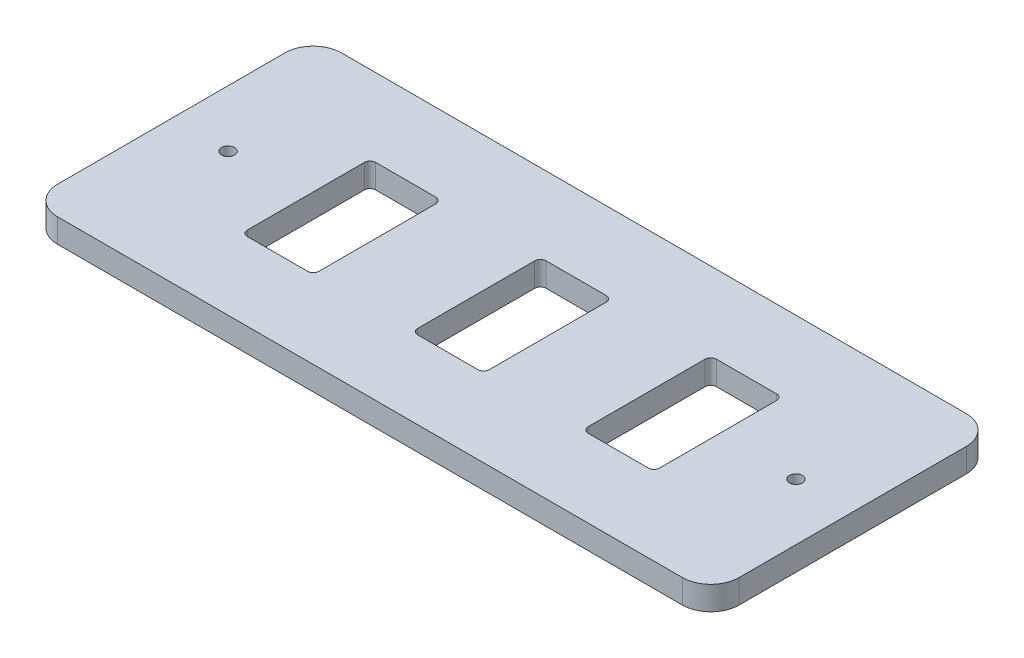
ISO-10303-21;
HEADER;
FILE_DESCRIPTION(('STEP AP214'),'2;1');
FILE_NAME('part.step','',(''),(''),'','','');
FILE_SCHEMA(('AUTOMOTIVE_DESIGN { 1 0 10303 214 1 1 1 1 }'));
ENDSEC;
DATA;
#1=APPLICATION_CONTEXT('core data for automotive mechanical design processes');
#2=APPLICATION_PROTOCOL_DEFINITION('international standard','automotive_design',2000,#1);
#3=PRODUCT_CONTEXT('',#1,'mechanical');
#4=PRODUCT('Part','Part','',(#3));
#5=PRODUCT_RELATED_PRODUCT_CATEGORY('part','',(#4));
#6=PRODUCT_DEFINITION_FORMATION('','',#4);
#7=PRODUCT_DEFINITION_CONTEXT('part definition',#1,'design');
#8=PRODUCT_DEFINITION('design','',#6,#7);
#9=PRODUCT_DEFINITION_SHAPE('','',#8);
#10=(LENGTH_UNIT() NAMED_UNIT(*) SI_UNIT(.MILLI.,.METRE.));
#11=(NAMED_UNIT(*) PLANE_ANGLE_UNIT() SI_UNIT($,.RADIAN.));
#12=(NAMED_UNIT(*) SI_UNIT($,.STERADIAN.) SOLID_ANGLE_UNIT());
#13=UNCERTAINTY_MEASURE_WITH_UNIT(LENGTH_MEASURE(1.E-05),#10,'distance_accuracy_value','');
#14=(GEOMETRIC_REPRESENTATION_CONTEXT(3) GLOBAL_UNCERTAINTY_ASSIGNED_CONTEXT((#13)) GLOBAL_UNIT_ASSIGNED_CONTEXT((#10,
#11,#12)) REPRESENTATION_CONTEXT('',''));
#15=CARTESIAN_POINT('',(0.,0.,0.));
#16=DIRECTION('',(0.,0.,1.));
#17=DIRECTION('',(1.,0.,0.));
#18=AXIS2_PLACEMENT_3D('',#15,#16,#17);
#19=CARTESIAN_POINT('',(0.,2.667,0.));
#20=DIRECTION('',(0.,1.,0.));
#21=DIRECTION('',(0.,0.,1.));
#22=AXIS2_PLACEMENT_3D('',#19,#20,#21);
#23=PLANE('',#22);
#24=CARTESIAN_POINT('',(-63.5000000000001,2.667,0.));
#25=DIRECTION('',(0.,1.,0.));
#26=DIRECTION('',(0.,0.,-1.));
#27=AXIS2_PLACEMENT_3D('',#24,#25,#26);
#28=CIRCLE('',#27,1.46050000000001);
#29=CARTESIAN_POINT('',(-63.5000000000001,2.667,-1.46049999999999));
#30=VERTEX_POINT('',#29);
#31=EDGE_CURVE('E475',#30,#30,#28,.T.);
#32=ORIENTED_EDGE('',*,*,#31,.F.);
#33=EDGE_LOOP('',(#32));
#34=FACE_BOUND('',#33,.T.);
#35=DIRECTION('',(-1.,0.,0.));
#36=VECTOR('',#35,1.);
#37=CARTESIAN_POINT('',(-76.2,2.667,-31.75));
#38=LINE('',#37,#36);
#39=CARTESIAN_POINT('',(69.8499999999999,2.667,-31.75));
#40=VERTEX_POINT('',#39);
#41=CARTESIAN_POINT('',(-69.8500000000001,2.667,-31.75));
#42=VERTEX_POINT('',#41);
#43=EDGE_CURVE('E446',#40,#42,#38,.T.);
#44=ORIENTED_EDGE('',*,*,#43,.T.);
#45=CARTESIAN_POINT('',(-69.8500000000001,2.667,-25.4));
#46=DIRECTION('',(0.,1.,0.));
#47=DIRECTION('',(0.,0.,1.));
#48=AXIS2_PLACEMENT_3D('',#45,#46,#47);
#49=CIRCLE('',#48,6.35);
#50=CARTESIAN_POINT('',(-76.2,2.667,-25.4));
#51=VERTEX_POINT('',#50);
#52=EDGE_CURVE('E466',#42,#51,#49,.T.);
#53=ORIENTED_EDGE('',*,*,#52,.T.);
#54=DIRECTION('',(0.,0.,1.));
#55=VECTOR('',#54,1.);
#56=CARTESIAN_POINT('',(-76.2,2.667,-31.75));
#57=LINE('',#56,#55);
#58=CARTESIAN_POINT('',(-76.2,2.667,25.4));
#59=VERTEX_POINT('',#58);
#60=EDGE_CURVE('E280',#51,#59,#57,.T.);
#61=ORIENTED_EDGE('',*,*,#60,.T.);
#62=CARTESIAN_POINT('',(-69.85,2.667,25.4));
#63=DIRECTION('',(0.,1.,0.));
#64=DIRECTION('',(0.,0.,1.));
#65=AXIS2_PLACEMENT_3D('',#62,#63,#64);
#66=CIRCLE('',#65,6.35);
#67=CARTESIAN_POINT('',(-69.85,2.667,31.75));
#68=VERTEX_POINT('',#67);
#69=EDGE_CURVE('E59',#59,#68,#66,.T.);
#70=ORIENTED_EDGE('',*,*,#69,.T.);
#71=DIRECTION('',(1.,0.,0.));
#72=VECTOR('',#71,1.);
#73=CARTESIAN_POINT('',(-76.2,2.667,31.75));
#74=LINE('',#73,#72);
#75=CARTESIAN_POINT('',(69.85,2.667,31.75));
#76=VERTEX_POINT('',#75);
#77=EDGE_CURVE('E275',#68,#76,#74,.T.);
#78=ORIENTED_EDGE('',*,*,#77,.T.);
#79=CARTESIAN_POINT('',(69.85,2.667,25.4));
#80=DIRECTION('',(0.,1.,0.));
#81=DIRECTION('',(0.,0.,1.));
#82=AXIS2_PLACEMENT_3D('',#79,#80,#81);
#83=CIRCLE('',#82,6.35);
#84=CARTESIAN_POINT('',(76.2,2.667,25.4));
#85=VERTEX_POINT('',#84);
#86=EDGE_CURVE('E416',#76,#85,#83,.T.);
#87=ORIENTED_EDGE('',*,*,#86,.T.);
#88=DIRECTION('',(0.,0.,-1.));
#89=VECTOR('',#88,1.);
#90=CARTESIAN_POINT('',(76.2,2.667,-31.75));
#91=LINE('',#90,#89);
#92=CARTESIAN_POINT('',(76.2,2.667,-25.4));
#93=VERTEX_POINT('',#92);
#94=EDGE_CURVE('E441',#85,#93,#91,.T.);
#95=ORIENTED_EDGE('',*,*,#94,.T.);
#96=CARTESIAN_POINT('',(69.85,2.667,-25.4));
#97=DIRECTION('',(0.,1.,0.));
#98=DIRECTION('',(0.,0.,1.));
#99=AXIS2_PLACEMENT_3D('',#96,#97,#98);
#100=CIRCLE('',#99,6.35);
#101=EDGE_CURVE('E463',#93,#40,#100,.T.);
#102=ORIENTED_EDGE('',*,*,#101,.T.);
#103=EDGE_LOOP('',(#44,#53,#61,#70,#78,#87,#95,#102));
#104=FACE_BOUND('',#103,.T.);
#105=DIRECTION('',(-1.,0.,0.));
#106=VECTOR('',#105,1.);
#107=CARTESIAN_POINT('',(-46.101,2.667,-14.351));
#108=LINE('',#107,#106);
#109=CARTESIAN_POINT('',(-31.369,2.667,-14.351));
#110=VERTEX_POINT('',#109);
#111=CARTESIAN_POINT('',(-44.831,2.667,-14.351));
#112=VERTEX_POINT('',#111);
#113=EDGE_CURVE('E548',#110,#112,#108,.T.);
#114=ORIENTED_EDGE('',*,*,#113,.F.);
#115=CARTESIAN_POINT('',(-31.369,2.667,-13.081));
#116=DIRECTION('',(0.,1.,0.));
#117=DIRECTION('',(0.,0.,1.));
#118=AXIS2_PLACEMENT_3D('',#115,#116,#117);
#119=CIRCLE('',#118,1.27);
#120=CARTESIAN_POINT('',(-30.099,2.667,-13.081));
#121=VERTEX_POINT('',#120);
#122=EDGE_CURVE('E382',#110,#121,#119,.F.);
#123=ORIENTED_EDGE('',*,*,#122,.T.);
#124=DIRECTION('',(0.,0.,-1.));
#125=VECTOR('',#124,1.);
#126=CARTESIAN_POINT('',(-30.099,2.667,-14.351));
#127=LINE('',#126,#125);
#128=CARTESIAN_POINT('',(-30.099,2.667,13.081));
#129=VERTEX_POINT('',#128);
#130=EDGE_CURVE('E544',#129,#121,#127,.T.);
#131=ORIENTED_EDGE('',*,*,#130,.F.);
#132=CARTESIAN_POINT('',(-31.369,2.667,13.081));
#133=DIRECTION('',(0.,1.,0.));
#134=DIRECTION('',(0.,0.,1.));
#135=AXIS2_PLACEMENT_3D('',#132,#133,#134);
#136=CIRCLE('',#135,1.27);
#137=CARTESIAN_POINT('',(-31.369,2.667,14.351));
#138=VERTEX_POINT('',#137);
#139=EDGE_CURVE('E392',#129,#138,#136,.F.);
#140=ORIENTED_EDGE('',*,*,#139,.T.);
#141=DIRECTION('',(1.,0.,0.));
#142=VECTOR('',#141,1.);
#143=CARTESIAN_POINT('',(-46.101,2.667,14.351));
#144=LINE('',#143,#142);
#145=CARTESIAN_POINT('',(-44.831,2.667,14.351));
#146=VERTEX_POINT('',#145);
#147=EDGE_CURVE('E434',#146,#138,#144,.T.);
#148=ORIENTED_EDGE('',*,*,#147,.F.);
#149=CARTESIAN_POINT('',(-44.831,2.667,13.081));
#150=DIRECTION('',(0.,1.,0.));
#151=DIRECTION('',(0.,0.,1.));
#152=AXIS2_PLACEMENT_3D('',#149,#150,#151);
#153=CIRCLE('',#152,1.27);
#154=CARTESIAN_POINT('',(-46.101,2.667,13.081));
#155=VERTEX_POINT('',#154);
#156=EDGE_CURVE('E387',#146,#155,#153,.F.);
#157=ORIENTED_EDGE('',*,*,#156,.T.);
#158=DIRECTION('',(0.,0.,1.));
#159=VECTOR('',#158,1.);
#160=CARTESIAN_POINT('',(-46.101,2.667,-14.351));
#161=LINE('',#160,#159);
#162=CARTESIAN_POINT('',(-46.101,2.667,-13.081));
#163=VERTEX_POINT('',#162);
#164=EDGE_CURVE('E557',#163,#155,#161,.T.);
#165=ORIENTED_EDGE('',*,*,#164,.F.);
#166=CARTESIAN_POINT('',(-44.831,2.667,-13.081));
#167=DIRECTION('',(0.,1.,0.));
#168=DIRECTION('',(0.,0.,1.));
#169=AXIS2_PLACEMENT_3D('',#166,#167,#168);
#170=CIRCLE('',#169,1.27);
#171=EDGE_CURVE('E377',#163,#112,#170,.F.);
#172=ORIENTED_EDGE('',*,*,#171,.T.);
#173=EDGE_LOOP('',(#114,#123,#131,#140,#148,#157,#165,#172));
#174=FACE_BOUND('',#173,.T.);
#175=DIRECTION('',(-1.,0.,0.));
#176=VECTOR('',#175,1.);
#177=CARTESIAN_POINT('',(-8.001,2.667,-14.351));
#178=LINE('',#177,#176);
#179=CARTESIAN_POINT('',(6.731,2.667,-14.351));
#180=VERTEX_POINT('',#179);
#181=CARTESIAN_POINT('',(-6.731,2.667,-14.351));
#182=VERTEX_POINT('',#181);
#183=EDGE_CURVE('E517',#180,#182,#178,.T.);
#184=ORIENTED_EDGE('',*,*,#183,.F.);
#185=CARTESIAN_POINT('',(6.731,2.667,-13.081));
#186=DIRECTION('',(0.,1.,0.));
#187=DIRECTION('',(0.,0.,1.));
#188=AXIS2_PLACEMENT_3D('',#185,#186,#187);
#189=CIRCLE('',#188,1.27);
#190=CARTESIAN_POINT('',(8.001,2.667,-13.081));
#191=VERTEX_POINT('',#190);
#192=EDGE_CURVE('E367',#180,#191,#189,.F.);
#193=ORIENTED_EDGE('',*,*,#192,.T.);
#194=DIRECTION('',(0.,0.,-1.));
#195=VECTOR('',#194,1.);
#196=CARTESIAN_POINT('',(8.001,2.667,-14.351));
#197=LINE('',#196,#195);
#198=CARTESIAN_POINT('',(8.001,2.667,13.081));
#199=VERTEX_POINT('',#198);
#200=EDGE_CURVE('E512',#199,#191,#197,.T.);
#201=ORIENTED_EDGE('',*,*,#200,.F.);
#202=CARTESIAN_POINT('',(6.731,2.667,13.081));
#203=DIRECTION('',(0.,1.,0.));
#204=DIRECTION('',(0.,0.,1.));
#205=AXIS2_PLACEMENT_3D('',#202,#203,#204);
#206=CIRCLE('',#205,1.27);
#207=CARTESIAN_POINT('',(6.731,2.667,14.351));
#208=VERTEX_POINT('',#207);
#209=EDGE_CURVE('E357',#199,#208,#206,.F.);
#210=ORIENTED_EDGE('',*,*,#209,.T.);
#211=DIRECTION('',(1.,0.,0.));
#212=VECTOR('',#211,1.);
#213=CARTESIAN_POINT('',(-8.001,2.667,14.351));
#214=LINE('',#213,#212);
#215=CARTESIAN_POINT('',(-6.731,2.667,14.351));
#216=VERTEX_POINT('',#215);
#217=EDGE_CURVE('E526',#216,#208,#214,.T.);
#218=ORIENTED_EDGE('',*,*,#217,.F.);
#219=CARTESIAN_POINT('',(-6.731,2.667,13.081));
#220=DIRECTION('',(0.,1.,0.));
#221=DIRECTION('',(0.,0.,1.));
#222=AXIS2_PLACEMENT_3D('',#219,#220,#221);
#223=CIRCLE('',#222,1.27);
#224=CARTESIAN_POINT('',(-8.001,2.667,13.081));
#225=VERTEX_POINT('',#224);
#226=EDGE_CURVE('E362',#216,#225,#223,.F.);
#227=ORIENTED_EDGE('',*,*,#226,.T.);
#228=DIRECTION('',(0.,0.,1.));
#229=VECTOR('',#228,1.);
#230=CARTESIAN_POINT('',(-8.001,2.667,-14.351));
#231=LINE('',#230,#229);
#232=CARTESIAN_POINT('',(-8.001,2.667,-13.081));
#233=VERTEX_POINT('',#232);
#234=EDGE_CURVE('E532',#233,#225,#231,.T.);
#235=ORIENTED_EDGE('',*,*,#234,.F.);
#236=CARTESIAN_POINT('',(-6.731,2.667,-13.081));
#237=DIRECTION('',(0.,1.,0.));
#238=DIRECTION('',(0.,0.,1.));
#239=AXIS2_PLACEMENT_3D('',#236,#237,#238);
#240=CIRCLE('',#239,1.27);
#241=EDGE_CURVE('E372',#233,#182,#240,.F.);
#242=ORIENTED_EDGE('',*,*,#241,.T.);
#243=EDGE_LOOP('',(#184,#193,#201,#210,#218,#227,#235,#242));
#244=FACE_BOUND('',#243,.T.);
#245=DIRECTION('',(-1.,0.,0.));
#246=VECTOR('',#245,1.);
#247=CARTESIAN_POINT('',(30.099,2.667,-14.351));
#248=LINE('',#247,#246);
#249=CARTESIAN_POINT('',(44.831,2.667,-14.351));
#250=VERTEX_POINT('',#249);
#251=CARTESIAN_POINT('',(31.369,2.667,-14.351));
#252=VERTEX_POINT('',#251);
#253=EDGE_CURVE('E492',#250,#252,#248,.T.);
#254=ORIENTED_EDGE('',*,*,#253,.F.);
#255=CARTESIAN_POINT('',(44.831,2.667,-13.081));
#256=DIRECTION('',(0.,1.,0.));
#257=DIRECTION('',(0.,0.,1.));
#258=AXIS2_PLACEMENT_3D('',#255,#256,#257);
#259=CIRCLE('',#258,1.27);
#260=CARTESIAN_POINT('',(46.101,2.667,-13.081));
#261=VERTEX_POINT('',#260);
#262=EDGE_CURVE('E261',#250,#261,#259,.F.);
#263=ORIENTED_EDGE('',*,*,#262,.T.);
#264=DIRECTION('',(0.,0.,-1.));
#265=VECTOR('',#264,1.);
#266=CARTESIAN_POINT('',(46.101,2.667,-14.351));
#267=LINE('',#266,#265);
#268=CARTESIAN_POINT('',(46.101,2.667,13.081));
#269=VERTEX_POINT('',#268);
#270=EDGE_CURVE('E487',#269,#261,#267,.T.);
#271=ORIENTED_EDGE('',*,*,#270,.F.);
#272=CARTESIAN_POINT('',(44.831,2.667,13.081));
#273=DIRECTION('',(0.,1.,0.));
#274=DIRECTION('',(0.,0.,1.));
#275=AXIS2_PLACEMENT_3D('',#272,#273,#274);
#276=CIRCLE('',#275,1.27);
#277=CARTESIAN_POINT('',(44.831,2.667,14.351));
#278=VERTEX_POINT('',#277);
#279=EDGE_CURVE('E352',#269,#278,#276,.F.);
#280=ORIENTED_EDGE('',*,*,#279,.T.);
#281=DIRECTION('',(1.,0.,0.));
#282=VECTOR('',#281,1.);
#283=CARTESIAN_POINT('',(30.099,2.667,14.351));
#284=LINE('',#283,#282);
#285=CARTESIAN_POINT('',(31.369,2.667,14.351));
#286=VERTEX_POINT('',#285);
#287=EDGE_CURVE('E500',#286,#278,#284,.T.);
#288=ORIENTED_EDGE('',*,*,#287,.F.);
#289=CARTESIAN_POINT('',(31.369,2.667,13.081));
#290=DIRECTION('',(0.,1.,0.));
#291=DIRECTION('',(0.,0.,1.));
#292=AXIS2_PLACEMENT_3D('',#289,#290,#291);
#293=CIRCLE('',#292,1.27);
#294=CARTESIAN_POINT('',(30.099,2.667,13.081));
#295=VERTEX_POINT('',#294);
#296=EDGE_CURVE('E341',#286,#295,#293,.F.);
#297=ORIENTED_EDGE('',*,*,#296,.T.);
#298=DIRECTION('',(0.,0.,1.));
#299=VECTOR('',#298,1.);
#300=CARTESIAN_POINT('',(30.099,2.667,-14.351));
#301=LINE('',#300,#299);
#302=CARTESIAN_POINT('',(30.099,2.667,-13.081));
#303=VERTEX_POINT('',#302);
#304=EDGE_CURVE('E506',#303,#295,#301,.T.);
#305=ORIENTED_EDGE('',*,*,#304,.F.);
#306=CARTESIAN_POINT('',(31.369,2.667,-13.081));
#307=DIRECTION('',(0.,1.,0.));
#308=DIRECTION('',(0.,0.,1.));
#309=AXIS2_PLACEMENT_3D('',#306,#307,#308);
#310=CIRCLE('',#309,1.27);
#311=EDGE_CURVE('E260',#303,#252,#310,.F.);
#312=ORIENTED_EDGE('',*,*,#311,.T.);
#313=EDGE_LOOP('',(#254,#263,#271,#280,#288,#297,#305,#312));
#314=FACE_BOUND('',#313,.T.);
#315=CARTESIAN_POINT('',(63.5,2.667,0.));
#316=DIRECTION('',(0.,1.,0.));
#317=DIRECTION('',(0.,0.,1.));
#318=AXIS2_PLACEMENT_3D('',#315,#316,#317);
#319=CIRCLE('',#318,1.4605);
#320=CARTESIAN_POINT('',(63.5,2.667,1.4605));
#321=VERTEX_POINT('',#320);
#322=EDGE_CURVE('E486',#321,#321,#319,.T.);
#323=ORIENTED_EDGE('',*,*,#322,.F.);
#324=EDGE_LOOP('',(#323));
#325=FACE_BOUND('',#324,.T.);
#326=ADVANCED_FACE('F39',(#34,#104,#174,#244,#314,#325),#23,.T.);
#327=CARTESIAN_POINT('',(0.,-2.667,0.));
#328=DIRECTION('',(0.,1.,0.));
#329=DIRECTION('',(0.,0.,1.));
#330=AXIS2_PLACEMENT_3D('',#327,#328,#329);
#331=PLANE('',#330);
#332=DIRECTION('',(1.,0.,0.));
#333=VECTOR('',#332,1.);
#334=CARTESIAN_POINT('',(-8.001,-2.667,14.351));
#335=LINE('',#334,#333);
#336=CARTESIAN_POINT('',(-6.731,-2.667,14.351));
#337=VERTEX_POINT('',#336);
#338=CARTESIAN_POINT('',(6.731,-2.667,14.351));
#339=VERTEX_POINT('',#338);
#340=EDGE_CURVE('E518',#337,#339,#335,.T.);
#341=ORIENTED_EDGE('',*,*,#340,.T.);
#342=CARTESIAN_POINT('',(6.731,-2.667,13.081));
#343=DIRECTION('',(0.,1.,0.));
#344=DIRECTION('',(0.,0.,1.));
#345=AXIS2_PLACEMENT_3D('',#342,#343,#344);
#346=CIRCLE('',#345,1.27);
#347=CARTESIAN_POINT('',(8.001,-2.667,13.081));
#348=VERTEX_POINT('',#347);
#349=EDGE_CURVE('E355',#339,#348,#346,.T.);
#350=ORIENTED_EDGE('',*,*,#349,.T.);
#351=DIRECTION('',(0.,0.,-1.));
#352=VECTOR('',#351,1.);
#353=CARTESIAN_POINT('',(8.001,-2.667,-14.351));
#354=LINE('',#353,#352);
#355=CARTESIAN_POINT('',(8.001,-2.667,-13.081));
#356=VERTEX_POINT('',#355);
#357=EDGE_CURVE('E505',#348,#356,#354,.T.);
#358=ORIENTED_EDGE('',*,*,#357,.T.);
#359=CARTESIAN_POINT('',(6.731,-2.667,-13.081));
#360=DIRECTION('',(0.,1.,0.));
#361=DIRECTION('',(0.,0.,1.));
#362=AXIS2_PLACEMENT_3D('',#359,#360,#361);
#363=CIRCLE('',#362,1.27);
#364=CARTESIAN_POINT('',(6.731,-2.667,-14.351));
#365=VERTEX_POINT('',#364);
#366=EDGE_CURVE('E365',#356,#365,#363,.T.);
#367=ORIENTED_EDGE('',*,*,#366,.T.);
#368=DIRECTION('',(-1.,0.,0.));
#369=VECTOR('',#368,1.);
#370=CARTESIAN_POINT('',(-8.001,-2.667,-14.351));
#371=LINE('',#370,#369);
#372=CARTESIAN_POINT('',(-6.731,-2.667,-14.351));
#373=VERTEX_POINT('',#372);
#374=EDGE_CURVE('E536',#365,#373,#371,.T.);
#375=ORIENTED_EDGE('',*,*,#374,.T.);
#376=CARTESIAN_POINT('',(-6.731,-2.667,-13.081));
#377=DIRECTION('',(0.,1.,0.));
#378=DIRECTION('',(0.,0.,1.));
#379=AXIS2_PLACEMENT_3D('',#376,#377,#378);
#380=CIRCLE('',#379,1.27);
#381=CARTESIAN_POINT('',(-8.001,-2.667,-13.081));
#382=VERTEX_POINT('',#381);
#383=EDGE_CURVE('E370',#373,#382,#380,.T.);
#384=ORIENTED_EDGE('',*,*,#383,.T.);
#385=DIRECTION('',(0.,0.,1.));
#386=VECTOR('',#385,1.);
#387=CARTESIAN_POINT('',(-8.001,-2.667,-14.351));
#388=LINE('',#387,#386);
#389=CARTESIAN_POINT('',(-8.001,-2.667,13.081));
#390=VERTEX_POINT('',#389);
#391=EDGE_CURVE('E539',#382,#390,#388,.T.);
#392=ORIENTED_EDGE('',*,*,#391,.T.);
#393=CARTESIAN_POINT('',(-6.731,-2.667,13.081));
#394=DIRECTION('',(0.,1.,0.));
#395=DIRECTION('',(0.,0.,1.));
#396=AXIS2_PLACEMENT_3D('',#393,#394,#395);
#397=CIRCLE('',#396,1.27);
#398=EDGE_CURVE('E360',#390,#337,#397,.T.);
#399=ORIENTED_EDGE('',*,*,#398,.T.);
#400=EDGE_LOOP('',(#341,#350,#358,#367,#375,#384,#392,#399));
#401=FACE_BOUND('',#400,.T.);
#402=DIRECTION('',(0.,0.,1.));
#403=VECTOR('',#402,1.);
#404=CARTESIAN_POINT('',(-76.2,-2.667,-31.75));
#405=LINE('',#404,#403);
#406=CARTESIAN_POINT('',(-76.2,-2.667,-25.4));
#407=VERTEX_POINT('',#406);
#408=CARTESIAN_POINT('',(-76.2,-2.667,25.4));
#409=VERTEX_POINT('',#408);
#410=EDGE_CURVE('E436',#407,#409,#405,.T.);
#411=ORIENTED_EDGE('',*,*,#410,.F.);
#412=CARTESIAN_POINT('',(-69.8500000000001,-2.667,-25.4));
#413=DIRECTION('',(0.,1.,0.));
#414=DIRECTION('',(0.,0.,1.));
#415=AXIS2_PLACEMENT_3D('',#412,#413,#414);
#416=CIRCLE('',#415,6.35);
#417=CARTESIAN_POINT('',(-69.8500000000001,-2.667,-31.75));
#418=VERTEX_POINT('',#417);
#419=EDGE_CURVE('E406',#407,#418,#416,.F.);
#420=ORIENTED_EDGE('',*,*,#419,.T.);
#421=DIRECTION('',(-1.,0.,0.));
#422=VECTOR('',#421,1.);
#423=CARTESIAN_POINT('',(-76.2,-2.667,-31.75));
#424=LINE('',#423,#422);
#425=CARTESIAN_POINT('',(69.8499999999999,-2.667,-31.75));
#426=VERTEX_POINT('',#425);
#427=EDGE_CURVE('E433',#426,#418,#424,.T.);
#428=ORIENTED_EDGE('',*,*,#427,.F.);
#429=CARTESIAN_POINT('',(69.85,-2.667,-25.4));
#430=DIRECTION('',(0.,1.,0.));
#431=DIRECTION('',(0.,0.,1.));
#432=AXIS2_PLACEMENT_3D('',#429,#430,#431);
#433=CIRCLE('',#432,6.35);
#434=CARTESIAN_POINT('',(76.2,-2.667,-25.4));
#435=VERTEX_POINT('',#434);
#436=EDGE_CURVE('E404',#426,#435,#433,.F.);
#437=ORIENTED_EDGE('',*,*,#436,.T.);
#438=DIRECTION('',(0.,0.,-1.));
#439=VECTOR('',#438,1.);
#440=CARTESIAN_POINT('',(76.2,-2.667,-31.75));
#441=LINE('',#440,#439);
#442=CARTESIAN_POINT('',(76.2,-2.667,25.4));
#443=VERTEX_POINT('',#442);
#444=EDGE_CURVE('E430',#443,#435,#441,.T.);
#445=ORIENTED_EDGE('',*,*,#444,.F.);
#446=CARTESIAN_POINT('',(69.85,-2.667,25.4));
#447=DIRECTION('',(0.,1.,0.));
#448=DIRECTION('',(0.,0.,1.));
#449=AXIS2_PLACEMENT_3D('',#446,#447,#448);
#450=CIRCLE('',#449,6.35);
#451=CARTESIAN_POINT('',(69.85,-2.667,31.75));
#452=VERTEX_POINT('',#451);
#453=EDGE_CURVE('E402',#443,#452,#450,.F.);
#454=ORIENTED_EDGE('',*,*,#453,.T.);
#455=DIRECTION('',(1.,0.,0.));
#456=VECTOR('',#455,1.);
#457=CARTESIAN_POINT('',(-76.2,-2.667,31.75));
#458=LINE('',#457,#456);
#459=CARTESIAN_POINT('',(-69.85,-2.667,31.75));
#460=VERTEX_POINT('',#459);
#461=EDGE_CURVE('E283',#460,#452,#458,.T.);
#462=ORIENTED_EDGE('',*,*,#461,.F.);
#463=CARTESIAN_POINT('',(-69.85,-2.667,25.4));
#464=DIRECTION('',(0.,1.,0.));
#465=DIRECTION('',(0.,0.,1.));
#466=AXIS2_PLACEMENT_3D('',#463,#464,#465);
#467=CIRCLE('',#466,6.35);
#468=EDGE_CURVE('E400',#460,#409,#467,.F.);
#469=ORIENTED_EDGE('',*,*,#468,.T.);
#470=EDGE_LOOP('',(#411,#420,#428,#437,#445,#454,#462,#469));
#471=FACE_BOUND('',#470,.T.);
#472=DIRECTION('',(1.,0.,0.));
#473=VECTOR('',#472,1.);
#474=CARTESIAN_POINT('',(-46.101,-2.667,14.351));
#475=LINE('',#474,#473);
#476=CARTESIAN_POINT('',(-44.831,-2.667,14.351));
#477=VERTEX_POINT('',#476);
#478=CARTESIAN_POINT('',(-31.369,-2.667,14.351));
#479=VERTEX_POINT('',#478);
#480=EDGE_CURVE('E456',#477,#479,#475,.T.);
#481=ORIENTED_EDGE('',*,*,#480,.T.);
#482=CARTESIAN_POINT('',(-31.369,-2.667,13.081));
#483=DIRECTION('',(0.,1.,0.));
#484=DIRECTION('',(0.,0.,1.));
#485=AXIS2_PLACEMENT_3D('',#482,#483,#484);
#486=CIRCLE('',#485,1.27);
#487=CARTESIAN_POINT('',(-30.099,-2.667,13.081));
#488=VERTEX_POINT('',#487);
#489=EDGE_CURVE('E390',#479,#488,#486,.T.);
#490=ORIENTED_EDGE('',*,*,#489,.T.);
#491=DIRECTION('',(0.,0.,-1.));
#492=VECTOR('',#491,1.);
#493=CARTESIAN_POINT('',(-30.099,-2.667,-14.351));
#494=LINE('',#493,#492);
#495=CARTESIAN_POINT('',(-30.099,-2.667,-13.081));
#496=VERTEX_POINT('',#495);
#497=EDGE_CURVE('E531',#488,#496,#494,.T.);
#498=ORIENTED_EDGE('',*,*,#497,.T.);
#499=CARTESIAN_POINT('',(-31.369,-2.667,-13.081));
#500=DIRECTION('',(0.,1.,0.));
#501=DIRECTION('',(0.,0.,1.));
#502=AXIS2_PLACEMENT_3D('',#499,#500,#501);
#503=CIRCLE('',#502,1.27);
#504=CARTESIAN_POINT('',(-31.369,-2.667,-14.351));
#505=VERTEX_POINT('',#504);
#506=EDGE_CURVE('E380',#496,#505,#503,.T.);
#507=ORIENTED_EDGE('',*,*,#506,.T.);
#508=DIRECTION('',(-1.,0.,0.));
#509=VECTOR('',#508,1.);
#510=CARTESIAN_POINT('',(-46.101,-2.667,-14.351));
#511=LINE('',#510,#509);
#512=CARTESIAN_POINT('',(-44.831,-2.667,-14.351));
#513=VERTEX_POINT('',#512);
#514=EDGE_CURVE('E561',#505,#513,#511,.T.);
#515=ORIENTED_EDGE('',*,*,#514,.T.);
#516=CARTESIAN_POINT('',(-44.831,-2.667,-13.081));
#517=DIRECTION('',(0.,1.,0.));
#518=DIRECTION('',(0.,0.,1.));
#519=AXIS2_PLACEMENT_3D('',#516,#517,#518);
#520=CIRCLE('',#519,1.27);
#521=CARTESIAN_POINT('',(-46.101,-2.667,-13.081));
#522=VERTEX_POINT('',#521);
#523=EDGE_CURVE('E375',#513,#522,#520,.T.);
#524=ORIENTED_EDGE('',*,*,#523,.T.);
#525=DIRECTION('',(0.,0.,1.));
#526=VECTOR('',#525,1.);
#527=CARTESIAN_POINT('',(-46.101,-2.667,-14.351));
#528=LINE('',#527,#526);
#529=CARTESIAN_POINT('',(-46.101,-2.667,13.081));
#530=VERTEX_POINT('',#529);
#531=EDGE_CURVE('E563',#522,#530,#528,.T.);
#532=ORIENTED_EDGE('',*,*,#531,.T.);
#533=CARTESIAN_POINT('',(-44.831,-2.667,13.081));
#534=DIRECTION('',(0.,1.,0.));
#535=DIRECTION('',(0.,0.,1.));
#536=AXIS2_PLACEMENT_3D('',#533,#534,#535);
#537=CIRCLE('',#536,1.27);
#538=EDGE_CURVE('E385',#530,#477,#537,.T.);
#539=ORIENTED_EDGE('',*,*,#538,.T.);
#540=EDGE_LOOP('',(#481,#490,#498,#507,#515,#524,#532,#539));
#541=FACE_BOUND('',#540,.T.);
#542=DIRECTION('',(1.,0.,0.));
#543=VECTOR('',#542,1.);
#544=CARTESIAN_POINT('',(30.099,-2.667,14.351));
#545=LINE('',#544,#543);
#546=CARTESIAN_POINT('',(31.369,-2.667,14.351));
#547=VERTEX_POINT('',#546);
#548=CARTESIAN_POINT('',(44.831,-2.667,14.351));
#549=VERTEX_POINT('',#548);
#550=EDGE_CURVE('E271',#547,#549,#545,.T.);
#551=ORIENTED_EDGE('',*,*,#550,.T.);
#552=CARTESIAN_POINT('',(44.831,-2.667,13.081));
#553=DIRECTION('',(0.,1.,0.));
#554=DIRECTION('',(0.,0.,1.));
#555=AXIS2_PLACEMENT_3D('',#552,#553,#554);
#556=CIRCLE('',#555,1.27);
#557=CARTESIAN_POINT('',(46.101,-2.667,13.081));
#558=VERTEX_POINT('',#557);
#559=EDGE_CURVE('E350',#549,#558,#556,.T.);
#560=ORIENTED_EDGE('',*,*,#559,.T.);
#561=DIRECTION('',(0.,0.,-1.));
#562=VECTOR('',#561,1.);
#563=CARTESIAN_POINT('',(46.101,-2.667,-14.351));
#564=LINE('',#563,#562);
#565=CARTESIAN_POINT('',(46.101,-2.667,-13.081));
#566=VERTEX_POINT('',#565);
#567=EDGE_CURVE('E481',#558,#566,#564,.T.);
#568=ORIENTED_EDGE('',*,*,#567,.T.);
#569=CARTESIAN_POINT('',(44.831,-2.667,-13.081));
#570=DIRECTION('',(0.,1.,0.));
#571=DIRECTION('',(0.,0.,1.));
#572=AXIS2_PLACEMENT_3D('',#569,#570,#571);
#573=CIRCLE('',#572,1.27);
#574=CARTESIAN_POINT('',(44.831,-2.667,-14.351));
#575=VERTEX_POINT('',#574);
#576=EDGE_CURVE('E344',#566,#575,#573,.T.);
#577=ORIENTED_EDGE('',*,*,#576,.T.);
#578=DIRECTION('',(-1.,0.,0.));
#579=VECTOR('',#578,1.);
#580=CARTESIAN_POINT('',(30.099,-2.667,-14.351));
#581=LINE('',#580,#579);
#582=CARTESIAN_POINT('',(31.369,-2.667,-14.351));
#583=VERTEX_POINT('',#582);
#584=EDGE_CURVE('E255',#575,#583,#581,.T.);
#585=ORIENTED_EDGE('',*,*,#584,.T.);
#586=CARTESIAN_POINT('',(31.369,-2.667,-13.081));
#587=DIRECTION('',(0.,1.,0.));
#588=DIRECTION('',(0.,0.,1.));
#589=AXIS2_PLACEMENT_3D('',#586,#587,#588);
#590=CIRCLE('',#589,1.27);
#591=CARTESIAN_POINT('',(30.099,-2.667,-13.081));
#592=VERTEX_POINT('',#591);
#593=EDGE_CURVE('E248',#583,#592,#590,.T.);
#594=ORIENTED_EDGE('',*,*,#593,.T.);
#595=DIRECTION('',(0.,0.,1.));
#596=VECTOR('',#595,1.);
#597=CARTESIAN_POINT('',(30.099,-2.667,-14.351));
#598=LINE('',#597,#596);
#599=CARTESIAN_POINT('',(30.099,-2.667,13.081));
#600=VERTEX_POINT('',#599);
#601=EDGE_CURVE('E253',#592,#600,#598,.T.);
#602=ORIENTED_EDGE('',*,*,#601,.T.);
#603=CARTESIAN_POINT('',(31.369,-2.667,13.081));
#604=DIRECTION('',(0.,1.,0.));
#605=DIRECTION('',(0.,0.,1.));
#606=AXIS2_PLACEMENT_3D('',#603,#604,#605);
#607=CIRCLE('',#606,1.27);
#608=EDGE_CURVE('E339',#600,#547,#607,.T.);
#609=ORIENTED_EDGE('',*,*,#608,.T.);
#610=EDGE_LOOP('',(#551,#560,#568,#577,#585,#594,#602,#609));
#611=FACE_BOUND('',#610,.T.);
#612=CARTESIAN_POINT('',(-63.5000000000001,-2.667,0.));
#613=DIRECTION('',(0.,1.,0.));
#614=DIRECTION('',(0.,0.,-1.));
#615=AXIS2_PLACEMENT_3D('',#612,#613,#614);
#616=CIRCLE('',#615,1.46050000000001);
#617=CARTESIAN_POINT('',(-63.5000000000001,-2.667,-1.46049999999999));
#618=VERTEX_POINT('',#617);
#619=EDGE_CURVE('E482',#618,#618,#616,.T.);
#620=ORIENTED_EDGE('',*,*,#619,.T.);
#621=EDGE_LOOP('',(#620));
#622=FACE_BOUND('',#621,.T.);
#623=CARTESIAN_POINT('',(63.5,-2.667,0.));
#624=DIRECTION('',(0.,1.,0.));
#625=DIRECTION('',(0.,0.,1.));
#626=AXIS2_PLACEMENT_3D('',#623,#624,#625);
#627=CIRCLE('',#626,1.4605);
#628=CARTESIAN_POINT('',(63.5,-2.667,1.4605));
#629=VERTEX_POINT('',#628);
#630=EDGE_CURVE('E483',#629,#629,#627,.T.);
#631=ORIENTED_EDGE('',*,*,#630,.T.);
#632=EDGE_LOOP('',(#631));
#633=FACE_BOUND('',#632,.T.);
#634=ADVANCED_FACE('F251',(#401,#471,#541,#611,#622,#633),#331,.F.);
#635=CARTESIAN_POINT('',(76.2,2.667,-31.75));
#636=DIRECTION('',(-1.,0.,0.));
#637=DIRECTION('',(0.,0.,1.));
#638=AXIS2_PLACEMENT_3D('',#635,#636,#637);
#639=PLANE('',#638);
#640=ORIENTED_EDGE('',*,*,#444,.T.);
#641=DIRECTION('',(0.,-1.,0.));
#642=VECTOR('',#641,1.);
#643=CARTESIAN_POINT('',(76.2,2.667,-25.4));
#644=LINE('',#643,#642);
#645=EDGE_CURVE('E765',#435,#93,#644,.F.);
#646=ORIENTED_EDGE('',*,*,#645,.T.);
#647=ORIENTED_EDGE('',*,*,#94,.F.);
#648=DIRECTION('',(0.,-1.,0.));
#649=VECTOR('',#648,1.);
#650=CARTESIAN_POINT('',(76.2,2.667,25.4));
#651=LINE('',#650,#649);
#652=EDGE_CURVE('E470',#85,#443,#651,.T.);
#653=ORIENTED_EDGE('',*,*,#652,.T.);
#654=EDGE_LOOP('',(#640,#646,#647,#653));
#655=FACE_BOUND('',#654,.T.);
#656=ADVANCED_FACE('F626',(#655),#639,.F.);
#657=CARTESIAN_POINT('',(-76.2,2.667,-31.75));
#658=DIRECTION('',(0.,0.,1.));
#659=DIRECTION('',(1.,0.,0.));
#660=AXIS2_PLACEMENT_3D('',#657,#658,#659);
#661=PLANE('',#660);
#662=ORIENTED_EDGE('',*,*,#427,.T.);
#663=DIRECTION('',(0.,-1.,0.));
#664=VECTOR('',#663,1.);
#665=CARTESIAN_POINT('',(-69.8500000000001,2.667,-31.75));
#666=LINE('',#665,#664);
#667=EDGE_CURVE('E411',#418,#42,#666,.F.);
#668=ORIENTED_EDGE('',*,*,#667,.T.);
#669=ORIENTED_EDGE('',*,*,#43,.F.);
#670=DIRECTION('',(0.,-1.,0.));
#671=VECTOR('',#670,1.);
#672=CARTESIAN_POINT('',(69.85,2.667,-31.75));
#673=LINE('',#672,#671);
#674=EDGE_CURVE('E408',#40,#426,#673,.T.);
#675=ORIENTED_EDGE('',*,*,#674,.T.);
#676=EDGE_LOOP('',(#662,#668,#669,#675));
#677=FACE_BOUND('',#676,.T.);
#678=ADVANCED_FACE('F639',(#677),#661,.F.);
#679=CARTESIAN_POINT('',(-76.2,2.667,-31.75));
#680=DIRECTION('',(1.,0.,0.));
#681=DIRECTION('',(0.,0.,-1.));
#682=AXIS2_PLACEMENT_3D('',#679,#680,#681);
#683=PLANE('',#682);
#684=ORIENTED_EDGE('',*,*,#60,.F.);
#685=DIRECTION('',(0.,-1.,0.));
#686=VECTOR('',#685,1.);
#687=CARTESIAN_POINT('',(-76.2,2.667,-25.4));
#688=LINE('',#687,#686);
#689=EDGE_CURVE('E397',#51,#407,#688,.T.);
#690=ORIENTED_EDGE('',*,*,#689,.T.);
#691=ORIENTED_EDGE('',*,*,#410,.T.);
#692=DIRECTION('',(0.,-1.,0.));
#693=VECTOR('',#692,1.);
#694=CARTESIAN_POINT('',(-76.2,2.667,25.4));
#695=LINE('',#694,#693);
#696=EDGE_CURVE('E395',#409,#59,#695,.F.);
#697=ORIENTED_EDGE('',*,*,#696,.T.);
#698=EDGE_LOOP('',(#684,#690,#691,#697));
#699=FACE_BOUND('',#698,.T.);
#700=ADVANCED_FACE('F636',(#699),#683,.F.);
#701=CARTESIAN_POINT('',(-76.2,2.667,31.75));
#702=DIRECTION('',(0.,0.,-1.));
#703=DIRECTION('',(-1.,0.,0.));
#704=AXIS2_PLACEMENT_3D('',#701,#702,#703);
#705=PLANE('',#704);
#706=ORIENTED_EDGE('',*,*,#461,.T.);
#707=DIRECTION('',(0.,-1.,0.));
#708=VECTOR('',#707,1.);
#709=CARTESIAN_POINT('',(69.85,2.667,31.75));
#710=LINE('',#709,#708);
#711=EDGE_CURVE('E12',#452,#76,#710,.F.);
#712=ORIENTED_EDGE('',*,*,#711,.T.);
#713=ORIENTED_EDGE('',*,*,#77,.F.);
#714=DIRECTION('',(0.,-1.,0.));
#715=VECTOR('',#714,1.);
#716=CARTESIAN_POINT('',(-69.85,2.667,31.75));
#717=LINE('',#716,#715);
#718=EDGE_CURVE('E47',#68,#460,#717,.T.);
#719=ORIENTED_EDGE('',*,*,#718,.T.);
#720=EDGE_LOOP('',(#706,#712,#713,#719));
#721=FACE_BOUND('',#720,.T.);
#722=ADVANCED_FACE('F633',(#721),#705,.F.);
#723=CARTESIAN_POINT('',(-30.099,2.667,-14.351));
#724=DIRECTION('',(-1.,0.,0.));
#725=DIRECTION('',(0.,0.,1.));
#726=AXIS2_PLACEMENT_3D('',#723,#724,#725);
#727=PLANE('',#726);
#728=ORIENTED_EDGE('',*,*,#130,.T.);
#729=DIRECTION('',(0.,-1.,0.));
#730=VECTOR('',#729,1.);
#731=CARTESIAN_POINT('',(-30.099,-2.667,-13.081));
#732=LINE('',#731,#730);
#733=EDGE_CURVE('E331',#121,#496,#732,.T.);
#734=ORIENTED_EDGE('',*,*,#733,.T.);
#735=ORIENTED_EDGE('',*,*,#497,.F.);
#736=DIRECTION('',(0.,-1.,0.));
#737=VECTOR('',#736,1.);
#738=CARTESIAN_POINT('',(-30.099,2.667,13.081));
#739=LINE('',#738,#737);
#740=EDGE_CURVE('E329',#488,#129,#739,.F.);
#741=ORIENTED_EDGE('',*,*,#740,.T.);
#742=EDGE_LOOP('',(#728,#734,#735,#741));
#743=FACE_BOUND('',#742,.T.);
#744=ADVANCED_FACE('F605',(#743),#727,.T.);
#745=CARTESIAN_POINT('',(-46.101,2.667,-14.351));
#746=DIRECTION('',(0.,0.,1.));
#747=DIRECTION('',(1.,0.,0.));
#748=AXIS2_PLACEMENT_3D('',#745,#746,#747);
#749=PLANE('',#748);
#750=ORIENTED_EDGE('',*,*,#113,.T.);
#751=DIRECTION('',(0.,-1.,0.));
#752=VECTOR('',#751,1.);
#753=CARTESIAN_POINT('',(-44.831,-2.667,-14.351));
#754=LINE('',#753,#752);
#755=EDGE_CURVE('E321',#112,#513,#754,.T.);
#756=ORIENTED_EDGE('',*,*,#755,.T.);
#757=ORIENTED_EDGE('',*,*,#514,.F.);
#758=DIRECTION('',(0.,-1.,0.));
#759=VECTOR('',#758,1.);
#760=CARTESIAN_POINT('',(-31.369,2.667,-14.351));
#761=LINE('',#760,#759);
#762=EDGE_CURVE('E319',#505,#110,#761,.F.);
#763=ORIENTED_EDGE('',*,*,#762,.T.);
#764=EDGE_LOOP('',(#750,#756,#757,#763));
#765=FACE_BOUND('',#764,.T.);
#766=ADVANCED_FACE('F593',(#765),#749,.T.);
#767=CARTESIAN_POINT('',(-46.101,2.667,-14.351));
#768=DIRECTION('',(1.,0.,0.));
#769=DIRECTION('',(0.,0.,-1.));
#770=AXIS2_PLACEMENT_3D('',#767,#768,#769);
#771=PLANE('',#770);
#772=ORIENTED_EDGE('',*,*,#531,.F.);
#773=DIRECTION('',(0.,-1.,0.));
#774=VECTOR('',#773,1.);
#775=CARTESIAN_POINT('',(-46.101,2.667,-13.081));
#776=LINE('',#775,#774);
#777=EDGE_CURVE('E327',#522,#163,#776,.F.);
#778=ORIENTED_EDGE('',*,*,#777,.T.);
#779=ORIENTED_EDGE('',*,*,#164,.T.);
#780=DIRECTION('',(0.,-1.,0.));
#781=VECTOR('',#780,1.);
#782=CARTESIAN_POINT('',(-46.101,-2.667,13.081));
#783=LINE('',#782,#781);
#784=EDGE_CURVE('E324',#155,#530,#783,.T.);
#785=ORIENTED_EDGE('',*,*,#784,.T.);
#786=EDGE_LOOP('',(#772,#778,#779,#785));
#787=FACE_BOUND('',#786,.T.);
#788=ADVANCED_FACE('F586',(#787),#771,.T.);
#789=CARTESIAN_POINT('',(-46.101,2.667,14.351));
#790=DIRECTION('',(0.,0.,-1.));
#791=DIRECTION('',(-1.,0.,0.));
#792=AXIS2_PLACEMENT_3D('',#789,#790,#791);
#793=PLANE('',#792);
#794=ORIENTED_EDGE('',*,*,#480,.F.);
#795=DIRECTION('',(0.,-1.,0.));
#796=VECTOR('',#795,1.);
#797=CARTESIAN_POINT('',(-44.831,2.667,14.351));
#798=LINE('',#797,#796);
#799=EDGE_CURVE('E337',#477,#146,#798,.F.);
#800=ORIENTED_EDGE('',*,*,#799,.T.);
#801=ORIENTED_EDGE('',*,*,#147,.T.);
#802=DIRECTION('',(0.,-1.,0.));
#803=VECTOR('',#802,1.);
#804=CARTESIAN_POINT('',(-31.369,-2.667,14.351));
#805=LINE('',#804,#803);
#806=EDGE_CURVE('E334',#138,#479,#805,.T.);
#807=ORIENTED_EDGE('',*,*,#806,.T.);
#808=EDGE_LOOP('',(#794,#800,#801,#807));
#809=FACE_BOUND('',#808,.T.);
#810=ADVANCED_FACE('F572',(#809),#793,.T.);
#811=CARTESIAN_POINT('',(8.001,2.667,-14.351));
#812=DIRECTION('',(-1.,0.,0.));
#813=DIRECTION('',(0.,0.,1.));
#814=AXIS2_PLACEMENT_3D('',#811,#812,#813);
#815=PLANE('',#814);
#816=ORIENTED_EDGE('',*,*,#357,.F.);
#817=DIRECTION('',(0.,-1.,0.));
#818=VECTOR('',#817,1.);
#819=CARTESIAN_POINT('',(8.001,2.667,13.081));
#820=LINE('',#819,#818);
#821=EDGE_CURVE('E307',#348,#199,#820,.F.);
#822=ORIENTED_EDGE('',*,*,#821,.T.);
#823=ORIENTED_EDGE('',*,*,#200,.T.);
#824=DIRECTION('',(0.,-1.,0.));
#825=VECTOR('',#824,1.);
#826=CARTESIAN_POINT('',(8.001,-2.667,-13.081));
#827=LINE('',#826,#825);
#828=EDGE_CURVE('E304',#191,#356,#827,.T.);
#829=ORIENTED_EDGE('',*,*,#828,.T.);
#830=EDGE_LOOP('',(#816,#822,#823,#829));
#831=FACE_BOUND('',#830,.T.);
#832=ADVANCED_FACE('F799',(#831),#815,.T.);
#833=CARTESIAN_POINT('',(-8.001,2.667,-14.351));
#834=DIRECTION('',(0.,0.,1.));
#835=DIRECTION('',(1.,0.,0.));
#836=AXIS2_PLACEMENT_3D('',#833,#834,#835);
#837=PLANE('',#836);
#838=ORIENTED_EDGE('',*,*,#374,.F.);
#839=DIRECTION('',(0.,-1.,0.));
#840=VECTOR('',#839,1.);
#841=CARTESIAN_POINT('',(6.731,2.667,-14.351));
#842=LINE('',#841,#840);
#843=EDGE_CURVE('E317',#365,#180,#842,.F.);
#844=ORIENTED_EDGE('',*,*,#843,.T.);
#845=ORIENTED_EDGE('',*,*,#183,.T.);
#846=DIRECTION('',(0.,-1.,0.));
#847=VECTOR('',#846,1.);
#848=CARTESIAN_POINT('',(-6.731,-2.667,-14.351));
#849=LINE('',#848,#847);
#850=EDGE_CURVE('E314',#182,#373,#849,.T.);
#851=ORIENTED_EDGE('',*,*,#850,.T.);
#852=EDGE_LOOP('',(#838,#844,#845,#851));
#853=FACE_BOUND('',#852,.T.);
#854=ADVANCED_FACE('F806',(#853),#837,.T.);
#855=CARTESIAN_POINT('',(-8.001,2.667,-14.351));
#856=DIRECTION('',(1.,0.,0.));
#857=DIRECTION('',(0.,0.,-1.));
#858=AXIS2_PLACEMENT_3D('',#855,#856,#857);
#859=PLANE('',#858);
#860=ORIENTED_EDGE('',*,*,#234,.T.);
#861=DIRECTION('',(0.,-1.,0.));
#862=VECTOR('',#861,1.);
#863=CARTESIAN_POINT('',(-8.001,-2.667,13.081));
#864=LINE('',#863,#862);
#865=EDGE_CURVE('E311',#225,#390,#864,.T.);
#866=ORIENTED_EDGE('',*,*,#865,.T.);
#867=ORIENTED_EDGE('',*,*,#391,.F.);
#868=DIRECTION('',(0.,-1.,0.));
#869=VECTOR('',#868,1.);
#870=CARTESIAN_POINT('',(-8.001,2.667,-13.081));
#871=LINE('',#870,#869);
#872=EDGE_CURVE('E309',#382,#233,#871,.F.);
#873=ORIENTED_EDGE('',*,*,#872,.T.);
#874=EDGE_LOOP('',(#860,#866,#867,#873));
#875=FACE_BOUND('',#874,.T.);
#876=ADVANCED_FACE('F814',(#875),#859,.T.);
#877=CARTESIAN_POINT('',(-8.001,2.667,14.351));
#878=DIRECTION('',(0.,0.,-1.));
#879=DIRECTION('',(-1.,0.,0.));
#880=AXIS2_PLACEMENT_3D('',#877,#878,#879);
#881=PLANE('',#880);
#882=ORIENTED_EDGE('',*,*,#217,.T.);
#883=DIRECTION('',(0.,-1.,0.));
#884=VECTOR('',#883,1.);
#885=CARTESIAN_POINT('',(6.731,-2.667,14.351));
#886=LINE('',#885,#884);
#887=EDGE_CURVE('E301',#208,#339,#886,.T.);
#888=ORIENTED_EDGE('',*,*,#887,.T.);
#889=ORIENTED_EDGE('',*,*,#340,.F.);
#890=DIRECTION('',(0.,-1.,0.));
#891=VECTOR('',#890,1.);
#892=CARTESIAN_POINT('',(-6.731,2.667,14.351));
#893=LINE('',#892,#891);
#894=EDGE_CURVE('E299',#337,#216,#893,.F.);
#895=ORIENTED_EDGE('',*,*,#894,.T.);
#896=EDGE_LOOP('',(#882,#888,#889,#895));
#897=FACE_BOUND('',#896,.T.);
#898=ADVANCED_FACE('F822',(#897),#881,.T.);
#899=CARTESIAN_POINT('',(46.101,2.667,-14.351));
#900=DIRECTION('',(-1.,0.,0.));
#901=DIRECTION('',(0.,0.,1.));
#902=AXIS2_PLACEMENT_3D('',#899,#900,#901);
#903=PLANE('',#902);
#904=ORIENTED_EDGE('',*,*,#270,.T.);
#905=DIRECTION('',(0.,-1.,0.));
#906=VECTOR('',#905,1.);
#907=CARTESIAN_POINT('',(46.101,-2.667,-13.081));
#908=LINE('',#907,#906);
#909=EDGE_CURVE('E292',#261,#566,#908,.T.);
#910=ORIENTED_EDGE('',*,*,#909,.T.);
#911=ORIENTED_EDGE('',*,*,#567,.F.);
#912=DIRECTION('',(0.,-1.,0.));
#913=VECTOR('',#912,1.);
#914=CARTESIAN_POINT('',(46.101,2.667,13.081));
#915=LINE('',#914,#913);
#916=EDGE_CURVE('E290',#558,#269,#915,.F.);
#917=ORIENTED_EDGE('',*,*,#916,.T.);
#918=EDGE_LOOP('',(#904,#910,#911,#917));
#919=FACE_BOUND('',#918,.T.);
#920=ADVANCED_FACE('F830',(#919),#903,.T.);
#921=CARTESIAN_POINT('',(30.099,2.667,-14.351));
#922=DIRECTION('',(0.,0.,1.));
#923=DIRECTION('',(1.,0.,0.));
#924=AXIS2_PLACEMENT_3D('',#921,#922,#923);
#925=PLANE('',#924);
#926=ORIENTED_EDGE('',*,*,#584,.F.);
#927=DIRECTION('',(0.,-1.,0.));
#928=VECTOR('',#927,1.);
#929=CARTESIAN_POINT('',(44.831,2.667,-14.351));
#930=LINE('',#929,#928);
#931=EDGE_CURVE('E297',#575,#250,#930,.F.);
#932=ORIENTED_EDGE('',*,*,#931,.T.);
#933=ORIENTED_EDGE('',*,*,#253,.T.);
#934=DIRECTION('',(0.,-1.,0.));
#935=VECTOR('',#934,1.);
#936=CARTESIAN_POINT('',(31.369,-2.667,-14.351));
#937=LINE('',#936,#935);
#938=EDGE_CURVE('E295',#252,#583,#937,.T.);
#939=ORIENTED_EDGE('',*,*,#938,.T.);
#940=EDGE_LOOP('',(#926,#932,#933,#939));
#941=FACE_BOUND('',#940,.T.);
#942=ADVANCED_FACE('F838',(#941),#925,.T.);
#943=CARTESIAN_POINT('',(30.099,2.667,-14.351));
#944=DIRECTION('',(1.,0.,0.));
#945=DIRECTION('',(0.,0.,-1.));
#946=AXIS2_PLACEMENT_3D('',#943,#944,#945);
#947=PLANE('',#946);
#948=ORIENTED_EDGE('',*,*,#304,.T.);
#949=DIRECTION('',(0.,-1.,0.));
#950=VECTOR('',#949,1.);
#951=CARTESIAN_POINT('',(30.099,-2.667,13.081));
#952=LINE('',#951,#950);
#953=EDGE_CURVE('E270',#295,#600,#952,.T.);
#954=ORIENTED_EDGE('',*,*,#953,.T.);
#955=ORIENTED_EDGE('',*,*,#601,.F.);
#956=DIRECTION('',(0.,-1.,0.));
#957=VECTOR('',#956,1.);
#958=CARTESIAN_POINT('',(30.099,2.667,-13.081));
#959=LINE('',#958,#957);
#960=EDGE_CURVE('E267',#592,#303,#959,.F.);
#961=ORIENTED_EDGE('',*,*,#960,.T.);
#962=EDGE_LOOP('',(#948,#954,#955,#961));
#963=FACE_BOUND('',#962,.T.);
#964=ADVANCED_FACE('F266',(#963),#947,.T.);
#965=CARTESIAN_POINT('',(30.099,2.667,14.351));
#966=DIRECTION('',(0.,0.,-1.));
#967=DIRECTION('',(-1.,0.,0.));
#968=AXIS2_PLACEMENT_3D('',#965,#966,#967);
#969=PLANE('',#968);
#970=ORIENTED_EDGE('',*,*,#550,.F.);
#971=DIRECTION('',(0.,-1.,0.));
#972=VECTOR('',#971,1.);
#973=CARTESIAN_POINT('',(31.369,2.667,14.351));
#974=LINE('',#973,#972);
#975=EDGE_CURVE('E288',#547,#286,#974,.F.);
#976=ORIENTED_EDGE('',*,*,#975,.T.);
#977=ORIENTED_EDGE('',*,*,#287,.T.);
#978=DIRECTION('',(0.,-1.,0.));
#979=VECTOR('',#978,1.);
#980=CARTESIAN_POINT('',(44.831,-2.667,14.351));
#981=LINE('',#980,#979);
#982=EDGE_CURVE('E277',#278,#549,#981,.T.);
#983=ORIENTED_EDGE('',*,*,#982,.T.);
#984=EDGE_LOOP('',(#970,#976,#977,#983));
#985=FACE_BOUND('',#984,.T.);
#986=ADVANCED_FACE('F853',(#985),#969,.T.);
#987=CARTESIAN_POINT('',(-63.5000000000001,2.667,0.));
#988=DIRECTION('',(0.,-1.,0.));
#989=DIRECTION('',(0.,0.,-1.));
#990=AXIS2_PLACEMENT_3D('',#987,#988,#989);
#991=CYLINDRICAL_SURFACE('',#990,1.46050000000001);
#992=ORIENTED_EDGE('',*,*,#31,.T.);
#993=EDGE_LOOP('',(#992));
#994=FACE_BOUND('',#993,.T.);
#995=ORIENTED_EDGE('',*,*,#619,.F.);
#996=EDGE_LOOP('',(#995));
#997=FACE_BOUND('',#996,.T.);
#998=ADVANCED_FACE('F860',(#994,#997),#991,.F.);
#999=CARTESIAN_POINT('',(63.5,2.667,0.));
#1000=DIRECTION('',(0.,-1.,0.));
#1001=DIRECTION('',(0.,0.,-1.));
#1002=AXIS2_PLACEMENT_3D('',#999,#1000,#1001);
#1003=CYLINDRICAL_SURFACE('',#1002,1.4605);
#1004=ORIENTED_EDGE('',*,*,#322,.T.);
#1005=EDGE_LOOP('',(#1004));
#1006=FACE_BOUND('',#1005,.T.);
#1007=ORIENTED_EDGE('',*,*,#630,.F.);
#1008=EDGE_LOOP('',(#1007));
#1009=FACE_BOUND('',#1008,.T.);
#1010=ADVANCED_FACE('F650',(#1006,#1009),#1003,.F.);
#1011=CARTESIAN_POINT('',(31.369,2.667,13.081));
#1012=DIRECTION('',(0.,1.,0.));
#1013=DIRECTION('',(0.,0.,1.));
#1014=AXIS2_PLACEMENT_3D('',#1011,#1012,#1013);
#1015=CYLINDRICAL_SURFACE('',#1014,1.27);
#1016=ORIENTED_EDGE('',*,*,#296,.F.);
#1017=ORIENTED_EDGE('',*,*,#975,.F.);
#1018=ORIENTED_EDGE('',*,*,#608,.F.);
#1019=ORIENTED_EDGE('',*,*,#953,.F.);
#1020=EDGE_LOOP('',(#1016,#1017,#1018,#1019));
#1021=FACE_BOUND('',#1020,.T.);
#1022=ADVANCED_FACE('F646',(#1021),#1015,.F.);
#1023=CARTESIAN_POINT('',(44.831,2.667,-13.081));
#1024=DIRECTION('',(0.,1.,0.));
#1025=DIRECTION('',(0.,0.,1.));
#1026=AXIS2_PLACEMENT_3D('',#1023,#1024,#1025);
#1027=CYLINDRICAL_SURFACE('',#1026,1.27);
#1028=ORIENTED_EDGE('',*,*,#262,.F.);
#1029=ORIENTED_EDGE('',*,*,#931,.F.);
#1030=ORIENTED_EDGE('',*,*,#576,.F.);
#1031=ORIENTED_EDGE('',*,*,#909,.F.);
#1032=EDGE_LOOP('',(#1028,#1029,#1030,#1031));
#1033=FACE_BOUND('',#1032,.T.);
#1034=ADVANCED_FACE('F649',(#1033),#1027,.F.);
#1035=CARTESIAN_POINT('',(31.369,2.667,-13.081));
#1036=DIRECTION('',(0.,1.,0.));
#1037=DIRECTION('',(0.,0.,1.));
#1038=AXIS2_PLACEMENT_3D('',#1035,#1036,#1037);
#1039=CYLINDRICAL_SURFACE('',#1038,1.27);
#1040=ORIENTED_EDGE('',*,*,#311,.F.);
#1041=ORIENTED_EDGE('',*,*,#960,.F.);
#1042=ORIENTED_EDGE('',*,*,#593,.F.);
#1043=ORIENTED_EDGE('',*,*,#938,.F.);
#1044=EDGE_LOOP('',(#1040,#1041,#1042,#1043));
#1045=FACE_BOUND('',#1044,.T.);
#1046=ADVANCED_FACE('F274',(#1045),#1039,.F.);
#1047=CARTESIAN_POINT('',(44.831,2.667,13.081));
#1048=DIRECTION('',(0.,1.,0.));
#1049=DIRECTION('',(0.,0.,1.));
#1050=AXIS2_PLACEMENT_3D('',#1047,#1048,#1049);
#1051=CYLINDRICAL_SURFACE('',#1050,1.27);
#1052=ORIENTED_EDGE('',*,*,#279,.F.);
#1053=ORIENTED_EDGE('',*,*,#916,.F.);
#1054=ORIENTED_EDGE('',*,*,#559,.F.);
#1055=ORIENTED_EDGE('',*,*,#982,.F.);
#1056=EDGE_LOOP('',(#1052,#1053,#1054,#1055));
#1057=FACE_BOUND('',#1056,.T.);
#1058=ADVANCED_FACE('F657',(#1057),#1051,.F.);
#1059=CARTESIAN_POINT('',(6.731,2.667,13.081));
#1060=DIRECTION('',(0.,1.,0.));
#1061=DIRECTION('',(0.,0.,1.));
#1062=AXIS2_PLACEMENT_3D('',#1059,#1060,#1061);
#1063=CYLINDRICAL_SURFACE('',#1062,1.27);
#1064=ORIENTED_EDGE('',*,*,#209,.F.);
#1065=ORIENTED_EDGE('',*,*,#821,.F.);
#1066=ORIENTED_EDGE('',*,*,#349,.F.);
#1067=ORIENTED_EDGE('',*,*,#887,.F.);
#1068=EDGE_LOOP('',(#1064,#1065,#1066,#1067));
#1069=FACE_BOUND('',#1068,.T.);
#1070=ADVANCED_FACE('F660',(#1069),#1063,.F.);
#1071=CARTESIAN_POINT('',(-6.731,2.667,13.081));
#1072=DIRECTION('',(0.,1.,0.));
#1073=DIRECTION('',(0.,0.,1.));
#1074=AXIS2_PLACEMENT_3D('',#1071,#1072,#1073);
#1075=CYLINDRICAL_SURFACE('',#1074,1.27);
#1076=ORIENTED_EDGE('',*,*,#226,.F.);
#1077=ORIENTED_EDGE('',*,*,#894,.F.);
#1078=ORIENTED_EDGE('',*,*,#398,.F.);
#1079=ORIENTED_EDGE('',*,*,#865,.F.);
#1080=EDGE_LOOP('',(#1076,#1077,#1078,#1079));
#1081=FACE_BOUND('',#1080,.T.);
#1082=ADVANCED_FACE('F664',(#1081),#1075,.F.);
#1083=CARTESIAN_POINT('',(6.731,2.667,-13.081));
#1084=DIRECTION('',(0.,1.,0.));
#1085=DIRECTION('',(0.,0.,1.));
#1086=AXIS2_PLACEMENT_3D('',#1083,#1084,#1085);
#1087=CYLINDRICAL_SURFACE('',#1086,1.27);
#1088=ORIENTED_EDGE('',*,*,#192,.F.);
#1089=ORIENTED_EDGE('',*,*,#843,.F.);
#1090=ORIENTED_EDGE('',*,*,#366,.F.);
#1091=ORIENTED_EDGE('',*,*,#828,.F.);
#1092=EDGE_LOOP('',(#1088,#1089,#1090,#1091));
#1093=FACE_BOUND('',#1092,.T.);
#1094=ADVANCED_FACE('F668',(#1093),#1087,.F.);
#1095=CARTESIAN_POINT('',(-6.731,2.667,-13.081));
#1096=DIRECTION('',(0.,1.,0.));
#1097=DIRECTION('',(0.,0.,1.));
#1098=AXIS2_PLACEMENT_3D('',#1095,#1096,#1097);
#1099=CYLINDRICAL_SURFACE('',#1098,1.27);
#1100=ORIENTED_EDGE('',*,*,#241,.F.);
#1101=ORIENTED_EDGE('',*,*,#872,.F.);
#1102=ORIENTED_EDGE('',*,*,#383,.F.);
#1103=ORIENTED_EDGE('',*,*,#850,.F.);
#1104=EDGE_LOOP('',(#1100,#1101,#1102,#1103));
#1105=FACE_BOUND('',#1104,.T.);
#1106=ADVANCED_FACE('F672',(#1105),#1099,.F.);
#1107=CARTESIAN_POINT('',(-44.831,2.667,-13.081));
#1108=DIRECTION('',(0.,1.,0.));
#1109=DIRECTION('',(0.,0.,1.));
#1110=AXIS2_PLACEMENT_3D('',#1107,#1108,#1109);
#1111=CYLINDRICAL_SURFACE('',#1110,1.27);
#1112=ORIENTED_EDGE('',*,*,#171,.F.);
#1113=ORIENTED_EDGE('',*,*,#777,.F.);
#1114=ORIENTED_EDGE('',*,*,#523,.F.);
#1115=ORIENTED_EDGE('',*,*,#755,.F.);
#1116=EDGE_LOOP('',(#1112,#1113,#1114,#1115));
#1117=FACE_BOUND('',#1116,.T.);
#1118=ADVANCED_FACE('F598',(#1117),#1111,.F.);
#1119=CARTESIAN_POINT('',(-31.369,2.667,-13.081));
#1120=DIRECTION('',(0.,1.,0.));
#1121=DIRECTION('',(0.,0.,1.));
#1122=AXIS2_PLACEMENT_3D('',#1119,#1120,#1121);
#1123=CYLINDRICAL_SURFACE('',#1122,1.27);
#1124=ORIENTED_EDGE('',*,*,#122,.F.);
#1125=ORIENTED_EDGE('',*,*,#762,.F.);
#1126=ORIENTED_EDGE('',*,*,#506,.F.);
#1127=ORIENTED_EDGE('',*,*,#733,.F.);
#1128=EDGE_LOOP('',(#1124,#1125,#1126,#1127));
#1129=FACE_BOUND('',#1128,.T.);
#1130=ADVANCED_FACE('F600',(#1129),#1123,.F.);
#1131=CARTESIAN_POINT('',(-44.831,2.667,13.081));
#1132=DIRECTION('',(0.,1.,0.));
#1133=DIRECTION('',(0.,0.,1.));
#1134=AXIS2_PLACEMENT_3D('',#1131,#1132,#1133);
#1135=CYLINDRICAL_SURFACE('',#1134,1.27);
#1136=ORIENTED_EDGE('',*,*,#156,.F.);
#1137=ORIENTED_EDGE('',*,*,#799,.F.);
#1138=ORIENTED_EDGE('',*,*,#538,.F.);
#1139=ORIENTED_EDGE('',*,*,#784,.F.);
#1140=EDGE_LOOP('',(#1136,#1137,#1138,#1139));
#1141=FACE_BOUND('',#1140,.T.);
#1142=ADVANCED_FACE('F577',(#1141),#1135,.F.);
#1143=CARTESIAN_POINT('',(-31.369,2.667,13.081));
#1144=DIRECTION('',(0.,1.,0.));
#1145=DIRECTION('',(0.,0.,1.));
#1146=AXIS2_PLACEMENT_3D('',#1143,#1144,#1145);
#1147=CYLINDRICAL_SURFACE('',#1146,1.27);
#1148=ORIENTED_EDGE('',*,*,#139,.F.);
#1149=ORIENTED_EDGE('',*,*,#740,.F.);
#1150=ORIENTED_EDGE('',*,*,#489,.F.);
#1151=ORIENTED_EDGE('',*,*,#806,.F.);
#1152=EDGE_LOOP('',(#1148,#1149,#1150,#1151));
#1153=FACE_BOUND('',#1152,.T.);
#1154=ADVANCED_FACE('F608',(#1153),#1147,.F.);
#1155=CARTESIAN_POINT('',(-69.8500000000001,2.667,-25.4));
#1156=DIRECTION('',(0.,-1.,0.));
#1157=DIRECTION('',(0.,0.,-1.));
#1158=AXIS2_PLACEMENT_3D('',#1155,#1156,#1157);
#1159=CYLINDRICAL_SURFACE('',#1158,6.35);
#1160=ORIENTED_EDGE('',*,*,#52,.F.);
#1161=ORIENTED_EDGE('',*,*,#667,.F.);
#1162=ORIENTED_EDGE('',*,*,#419,.F.);
#1163=ORIENTED_EDGE('',*,*,#689,.F.);
#1164=EDGE_LOOP('',(#1160,#1161,#1162,#1163));
#1165=FACE_BOUND('',#1164,.T.);
#1166=ADVANCED_FACE('F610',(#1165),#1159,.T.);
#1167=CARTESIAN_POINT('',(69.85,2.667,-25.4));
#1168=DIRECTION('',(0.,-1.,0.));
#1169=DIRECTION('',(0.,0.,-1.));
#1170=AXIS2_PLACEMENT_3D('',#1167,#1168,#1169);
#1171=CYLINDRICAL_SURFACE('',#1170,6.35);
#1172=ORIENTED_EDGE('',*,*,#101,.F.);
#1173=ORIENTED_EDGE('',*,*,#645,.F.);
#1174=ORIENTED_EDGE('',*,*,#436,.F.);
#1175=ORIENTED_EDGE('',*,*,#674,.F.);
#1176=EDGE_LOOP('',(#1172,#1173,#1174,#1175));
#1177=FACE_BOUND('',#1176,.T.);
#1178=ADVANCED_FACE('F616',(#1177),#1171,.T.);
#1179=CARTESIAN_POINT('',(69.85,2.667,25.4));
#1180=DIRECTION('',(0.,-1.,0.));
#1181=DIRECTION('',(0.,0.,-1.));
#1182=AXIS2_PLACEMENT_3D('',#1179,#1180,#1181);
#1183=CYLINDRICAL_SURFACE('',#1182,6.35);
#1184=ORIENTED_EDGE('',*,*,#86,.F.);
#1185=ORIENTED_EDGE('',*,*,#711,.F.);
#1186=ORIENTED_EDGE('',*,*,#453,.F.);
#1187=ORIENTED_EDGE('',*,*,#652,.F.);
#1188=EDGE_LOOP('',(#1184,#1185,#1186,#1187));
#1189=FACE_BOUND('',#1188,.T.);
#1190=ADVANCED_FACE('F743',(#1189),#1183,.T.);
#1191=CARTESIAN_POINT('',(-69.85,2.667,25.4));
#1192=DIRECTION('',(0.,-1.,0.));
#1193=DIRECTION('',(0.,0.,-1.));
#1194=AXIS2_PLACEMENT_3D('',#1191,#1192,#1193);
#1195=CYLINDRICAL_SURFACE('',#1194,6.35);
#1196=ORIENTED_EDGE('',*,*,#69,.F.);
#1197=ORIENTED_EDGE('',*,*,#696,.F.);
#1198=ORIENTED_EDGE('',*,*,#468,.F.);
#1199=ORIENTED_EDGE('',*,*,#718,.F.);
#1200=EDGE_LOOP('',(#1196,#1197,#1198,#1199));
#1201=FACE_BOUND('',#1200,.T.);
#1202=ADVANCED_FACE('F41',(#1201),#1195,.T.);
#1203=CLOSED_SHELL('',(#326,#634,#656,#678,#700,#722,#744,#766,#788,#810,#832,#854,#876,#898,
#920,#942,#964,#986,#998,#1010,#1022,#1034,#1046,#1058,#1070,#1082,#1094,#1106,#1118,#1130,
#1142,#1154,#1166,#1178,#1190,#1202));
#1204=MANIFOLD_SOLID_BREP('B2',#1203);
#1205=ADVANCED_BREP_SHAPE_REPRESENTATION('',(#18,#1204),#14);
#1206=SHAPE_DEFINITION_REPRESENTATION(#9,#1205);
ENDSEC;
END-ISO-10303-21;
